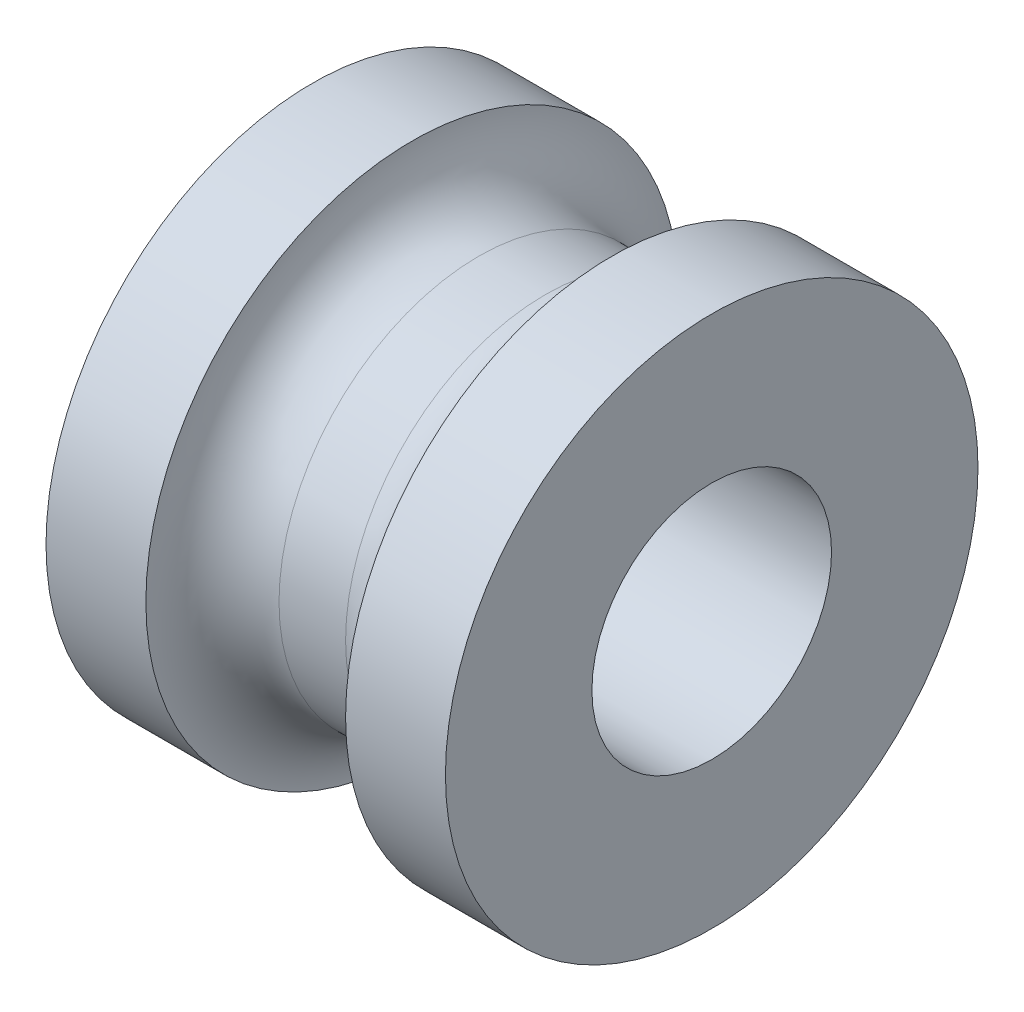
ISO-10303-21;
HEADER;
FILE_DESCRIPTION(('STEP AP214'),'2;1');
FILE_NAME('part.step','',(''),(''),'','','');
FILE_SCHEMA(('AUTOMOTIVE_DESIGN { 1 0 10303 214 1 1 1 1 }'));
ENDSEC;
DATA;
#1=APPLICATION_CONTEXT('core data for automotive mechanical design processes');
#2=APPLICATION_PROTOCOL_DEFINITION('international standard','automotive_design',2000,#1);
#3=PRODUCT_CONTEXT('',#1,'mechanical');
#4=PRODUCT('Part','Part','',(#3));
#5=PRODUCT_RELATED_PRODUCT_CATEGORY('part','',(#4));
#6=PRODUCT_DEFINITION_FORMATION('','',#4);
#7=PRODUCT_DEFINITION_CONTEXT('part definition',#1,'design');
#8=PRODUCT_DEFINITION('design','',#6,#7);
#9=PRODUCT_DEFINITION_SHAPE('','',#8);
#10=(LENGTH_UNIT() NAMED_UNIT(*) SI_UNIT(.MILLI.,.METRE.));
#11=(NAMED_UNIT(*) PLANE_ANGLE_UNIT() SI_UNIT($,.RADIAN.));
#12=(NAMED_UNIT(*) SI_UNIT($,.STERADIAN.) SOLID_ANGLE_UNIT());
#13=UNCERTAINTY_MEASURE_WITH_UNIT(LENGTH_MEASURE(1.E-05),#10,'distance_accuracy_value','');
#14=(GEOMETRIC_REPRESENTATION_CONTEXT(3) GLOBAL_UNCERTAINTY_ASSIGNED_CONTEXT((#13)) GLOBAL_UNIT_ASSIGNED_CONTEXT((#10,
#11,#12)) REPRESENTATION_CONTEXT('',''));
#15=CARTESIAN_POINT('',(0.,0.,0.));
#16=DIRECTION('',(0.,0.,1.));
#17=DIRECTION('',(1.,0.,0.));
#18=AXIS2_PLACEMENT_3D('',#15,#16,#17);
#19=CARTESIAN_POINT('',(1.5,0.,0.));
#20=DIRECTION('',(-1.,0.,0.));
#21=DIRECTION('',(0.,0.,1.));
#22=AXIS2_PLACEMENT_3D('',#19,#20,#21);
#23=CYLINDRICAL_SURFACE('',#22,4.);
#24=CARTESIAN_POINT('',(1.5,0.,0.));
#25=DIRECTION('',(1.,0.,0.));
#26=DIRECTION('',(0.,0.,-1.));
#27=AXIS2_PLACEMENT_3D('',#24,#25,#26);
#28=CIRCLE('',#27,4.);
#29=CARTESIAN_POINT('',(1.5,0.,-4.));
#30=VERTEX_POINT('',#29);
#31=EDGE_CURVE('E42',#30,#30,#28,.T.);
#32=ORIENTED_EDGE('',*,*,#31,.F.);
#33=EDGE_LOOP('',(#32));
#34=FACE_BOUND('',#33,.T.);
#35=CARTESIAN_POINT('',(0.,0.,0.));
#36=DIRECTION('',(1.,0.,0.));
#37=DIRECTION('',(0.,0.,-1.));
#38=AXIS2_PLACEMENT_3D('',#35,#36,#37);
#39=CIRCLE('',#38,4.);
#40=CARTESIAN_POINT('',(0.,0.,-4.));
#41=VERTEX_POINT('',#40);
#42=EDGE_CURVE('E46',#41,#41,#39,.T.);
#43=ORIENTED_EDGE('',*,*,#42,.T.);
#44=EDGE_LOOP('',(#43));
#45=FACE_BOUND('',#44,.T.);
#46=ADVANCED_FACE('F31',(#34,#45),#23,.T.);
#47=CARTESIAN_POINT('',(0.,0.,0.));
#48=DIRECTION('',(1.,0.,0.));
#49=DIRECTION('',(0.,0.,-1.));
#50=AXIS2_PLACEMENT_3D('',#47,#48,#49);
#51=PLANE('',#50);
#52=CARTESIAN_POINT('',(0.,0.,0.));
#53=DIRECTION('',(-1.,0.,0.));
#54=DIRECTION('',(0.,0.,1.));
#55=AXIS2_PLACEMENT_3D('',#52,#53,#54);
#56=CIRCLE('',#55,1.8);
#57=CARTESIAN_POINT('',(0.,0.,1.8));
#58=VERTEX_POINT('',#57);
#59=EDGE_CURVE('E58',#58,#58,#56,.T.);
#60=ORIENTED_EDGE('',*,*,#59,.F.);
#61=EDGE_LOOP('',(#60));
#62=FACE_BOUND('',#61,.T.);
#63=ORIENTED_EDGE('',*,*,#42,.F.);
#64=EDGE_LOOP('',(#63));
#65=FACE_BOUND('',#64,.T.);
#66=ADVANCED_FACE('F73',(#62,#65),#51,.F.);
#67=CARTESIAN_POINT('',(4.5,0.,0.));
#68=DIRECTION('',(-1.,0.,0.));
#69=DIRECTION('',(0.,0.,1.));
#70=AXIS2_PLACEMENT_3D('',#67,#68,#69);
#71=CYLINDRICAL_SURFACE('',#70,3.);
#72=CARTESIAN_POINT('',(3.5,0.,0.));
#73=DIRECTION('',(1.,0.,0.));
#74=DIRECTION('',(0.,0.,-1.));
#75=AXIS2_PLACEMENT_3D('',#72,#73,#74);
#76=CIRCLE('',#75,3.);
#77=CARTESIAN_POINT('',(3.5,0.,-3.));
#78=VERTEX_POINT('',#77);
#79=EDGE_CURVE('E10',#78,#78,#76,.F.);
#80=ORIENTED_EDGE('',*,*,#79,.T.);
#81=EDGE_LOOP('',(#80));
#82=FACE_BOUND('',#81,.T.);
#83=CARTESIAN_POINT('',(2.5,0.,0.));
#84=DIRECTION('',(1.,0.,0.));
#85=DIRECTION('',(0.,0.,-1.));
#86=AXIS2_PLACEMENT_3D('',#83,#84,#85);
#87=CIRCLE('',#86,3.);
#88=CARTESIAN_POINT('',(2.5,0.,-3.));
#89=VERTEX_POINT('',#88);
#90=EDGE_CURVE('E38',#89,#89,#87,.T.);
#91=ORIENTED_EDGE('',*,*,#90,.T.);
#92=EDGE_LOOP('',(#91));
#93=FACE_BOUND('',#92,.T.);
#94=ADVANCED_FACE('F76',(#82,#93),#71,.T.);
#95=CARTESIAN_POINT('',(6.,0.,0.));
#96=DIRECTION('',(-1.,0.,0.));
#97=DIRECTION('',(0.,0.,1.));
#98=AXIS2_PLACEMENT_3D('',#95,#96,#97);
#99=CYLINDRICAL_SURFACE('',#98,4.);
#100=CARTESIAN_POINT('',(6.,0.,0.));
#101=DIRECTION('',(1.,0.,0.));
#102=DIRECTION('',(0.,0.,-1.));
#103=AXIS2_PLACEMENT_3D('',#100,#101,#102);
#104=CIRCLE('',#103,4.);
#105=CARTESIAN_POINT('',(6.,0.,-4.));
#106=VERTEX_POINT('',#105);
#107=EDGE_CURVE('E50',#106,#106,#104,.T.);
#108=ORIENTED_EDGE('',*,*,#107,.F.);
#109=EDGE_LOOP('',(#108));
#110=FACE_BOUND('',#109,.T.);
#111=CARTESIAN_POINT('',(4.5,0.,0.));
#112=DIRECTION('',(1.,0.,0.));
#113=DIRECTION('',(0.,0.,-1.));
#114=AXIS2_PLACEMENT_3D('',#111,#112,#113);
#115=CIRCLE('',#114,4.);
#116=CARTESIAN_POINT('',(4.5,0.,-4.));
#117=VERTEX_POINT('',#116);
#118=EDGE_CURVE('E52',#117,#117,#115,.T.);
#119=ORIENTED_EDGE('',*,*,#118,.T.);
#120=EDGE_LOOP('',(#119));
#121=FACE_BOUND('',#120,.T.);
#122=ADVANCED_FACE('F95',(#110,#121),#99,.T.);
#123=CARTESIAN_POINT('',(6.,0.,0.));
#124=DIRECTION('',(1.,0.,0.));
#125=DIRECTION('',(0.,0.,-1.));
#126=AXIS2_PLACEMENT_3D('',#123,#124,#125);
#127=PLANE('',#126);
#128=CARTESIAN_POINT('',(6.,0.,0.));
#129=DIRECTION('',(-1.,0.,0.));
#130=DIRECTION('',(0.,0.,1.));
#131=AXIS2_PLACEMENT_3D('',#128,#129,#130);
#132=CIRCLE('',#131,1.8);
#133=CARTESIAN_POINT('',(6.,0.,1.8));
#134=VERTEX_POINT('',#133);
#135=EDGE_CURVE('E55',#134,#134,#132,.T.);
#136=ORIENTED_EDGE('',*,*,#135,.T.);
#137=EDGE_LOOP('',(#136));
#138=FACE_BOUND('',#137,.T.);
#139=ORIENTED_EDGE('',*,*,#107,.T.);
#140=EDGE_LOOP('',(#139));
#141=FACE_BOUND('',#140,.T.);
#142=ADVANCED_FACE('F64',(#138,#141),#127,.T.);
#143=CARTESIAN_POINT('',(3.5,0.,0.));
#144=DIRECTION('',(1.,0.,0.));
#145=DIRECTION('',(0.,0.,-1.));
#146=AXIS2_PLACEMENT_3D('',#143,#144,#145);
#147=TOROIDAL_SURFACE('',#146,4.,1.);
#148=ORIENTED_EDGE('',*,*,#79,.F.);
#149=EDGE_LOOP('',(#148));
#150=FACE_BOUND('',#149,.T.);
#151=ORIENTED_EDGE('',*,*,#118,.F.);
#152=EDGE_LOOP('',(#151));
#153=FACE_BOUND('',#152,.T.);
#154=ADVANCED_FACE('F87',(#150,#153),#147,.F.);
#155=CARTESIAN_POINT('',(2.5,0.,0.));
#156=DIRECTION('',(1.,0.,0.));
#157=DIRECTION('',(0.,0.,-1.));
#158=AXIS2_PLACEMENT_3D('',#155,#156,#157);
#159=TOROIDAL_SURFACE('',#158,4.,1.);
#160=ORIENTED_EDGE('',*,*,#31,.T.);
#161=EDGE_LOOP('',(#160));
#162=FACE_BOUND('',#161,.T.);
#163=ORIENTED_EDGE('',*,*,#90,.F.);
#164=EDGE_LOOP('',(#163));
#165=FACE_BOUND('',#164,.T.);
#166=ADVANCED_FACE('F33',(#162,#165),#159,.F.);
#167=CARTESIAN_POINT('',(6.,0.,0.));
#168=DIRECTION('',(-1.,0.,0.));
#169=DIRECTION('',(0.,0.,1.));
#170=AXIS2_PLACEMENT_3D('',#167,#168,#169);
#171=CYLINDRICAL_SURFACE('',#170,1.8);
#172=ORIENTED_EDGE('',*,*,#135,.F.);
#173=EDGE_LOOP('',(#172));
#174=FACE_BOUND('',#173,.T.);
#175=ORIENTED_EDGE('',*,*,#59,.T.);
#176=EDGE_LOOP('',(#175));
#177=FACE_BOUND('',#176,.T.);
#178=ADVANCED_FACE('F67',(#174,#177),#171,.F.);
#179=CLOSED_SHELL('',(#46,#66,#94,#122,#142,#154,#166,#178));
#180=MANIFOLD_SOLID_BREP('B2',#179);
#181=ADVANCED_BREP_SHAPE_REPRESENTATION('',(#18,#180),#14);
#182=SHAPE_DEFINITION_REPRESENTATION(#9,#181);
ENDSEC;
END-ISO-10303-21;
